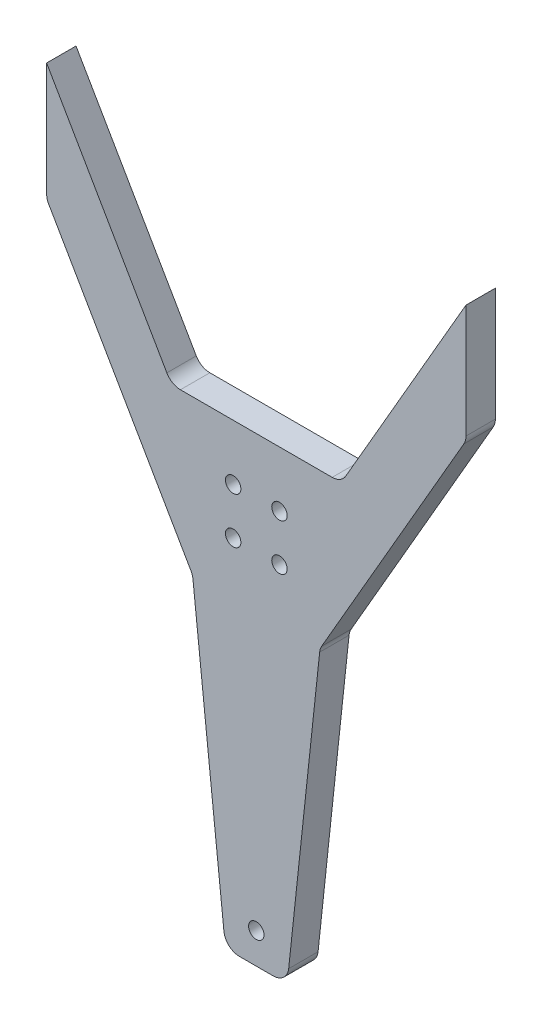
ISO-10303-21;
HEADER;
FILE_DESCRIPTION(('STEP AP214'),'2;1');
FILE_NAME('part.step','',(''),(''),'','','');
FILE_SCHEMA(('AUTOMOTIVE_DESIGN { 1 0 10303 214 1 1 1 1 }'));
ENDSEC;
DATA;
#1=APPLICATION_CONTEXT('core data for automotive mechanical design processes');
#2=APPLICATION_PROTOCOL_DEFINITION('international standard','automotive_design',2000,#1);
#3=PRODUCT_CONTEXT('',#1,'mechanical');
#4=PRODUCT('Part','Part','',(#3));
#5=PRODUCT_RELATED_PRODUCT_CATEGORY('part','',(#4));
#6=PRODUCT_DEFINITION_FORMATION('','',#4);
#7=PRODUCT_DEFINITION_CONTEXT('part definition',#1,'design');
#8=PRODUCT_DEFINITION('design','',#6,#7);
#9=PRODUCT_DEFINITION_SHAPE('','',#8);
#10=(LENGTH_UNIT() NAMED_UNIT(*) SI_UNIT(.MILLI.,.METRE.));
#11=(NAMED_UNIT(*) PLANE_ANGLE_UNIT() SI_UNIT($,.RADIAN.));
#12=(NAMED_UNIT(*) SI_UNIT($,.STERADIAN.) SOLID_ANGLE_UNIT());
#13=UNCERTAINTY_MEASURE_WITH_UNIT(LENGTH_MEASURE(1.E-05),#10,'distance_accuracy_value','');
#14=(GEOMETRIC_REPRESENTATION_CONTEXT(3) GLOBAL_UNCERTAINTY_ASSIGNED_CONTEXT((#13)) GLOBAL_UNIT_ASSIGNED_CONTEXT((#10,
#11,#12)) REPRESENTATION_CONTEXT('',''));
#15=CARTESIAN_POINT('',(0.,0.,0.));
#16=DIRECTION('',(0.,0.,1.));
#17=DIRECTION('',(1.,0.,0.));
#18=AXIS2_PLACEMENT_3D('',#15,#16,#17);
#19=CARTESIAN_POINT('',(-67.9249870466306,120.,9.525));
#20=DIRECTION('',(-0.866025403784436,-0.500000000000004,0.));
#21=DIRECTION('',(0.500000000000004,-0.866025403784436,0.));
#22=AXIS2_PLACEMENT_3D('',#19,#20,#21);
#23=PLANE('',#22);
#24=DIRECTION('',(-0.500000000000004,0.866025403784436,0.));
#25=VECTOR('',#24,1.);
#26=CARTESIAN_POINT('',(-67.9249870466306,120.,9.525));
#27=LINE('',#26,#25);
#28=CARTESIAN_POINT('',(-28.976937887098,52.5400000000001,9.525));
#29=VERTEX_POINT('',#28);
#30=CARTESIAN_POINT('',(-67.9249870466306,120.,9.525));
#31=VERTEX_POINT('',#30);
#32=EDGE_CURVE('E166',#29,#31,#27,.T.);
#33=ORIENTED_EDGE('',*,*,#32,.F.);
#34=DIRECTION('',(0.,0.,-1.));
#35=VECTOR('',#34,1.);
#36=CARTESIAN_POINT('',(-28.976937887098,52.5400000000001,0.));
#37=LINE('',#36,#35);
#38=CARTESIAN_POINT('',(-28.976937887098,52.5400000000001,0.));
#39=VERTEX_POINT('',#38);
#40=EDGE_CURVE('E276',#29,#39,#37,.T.);
#41=ORIENTED_EDGE('',*,*,#40,.T.);
#42=DIRECTION('',(-0.500000000000004,0.866025403784436,0.));
#43=VECTOR('',#42,1.);
#44=CARTESIAN_POINT('',(-67.9249870466306,120.,0.));
#45=LINE('',#44,#43);
#46=CARTESIAN_POINT('',(-67.9249870466306,120.,0.));
#47=VERTEX_POINT('',#46);
#48=EDGE_CURVE('E190',#39,#47,#45,.T.);
#49=ORIENTED_EDGE('',*,*,#48,.T.);
#50=DIRECTION('',(0.,0.,-1.));
#51=VECTOR('',#50,1.);
#52=CARTESIAN_POINT('',(-67.9249870466306,120.,9.525));
#53=LINE('',#52,#51);
#54=EDGE_CURVE('E184',#31,#47,#53,.T.);
#55=ORIENTED_EDGE('',*,*,#54,.F.);
#56=EDGE_LOOP('',(#33,#41,#49,#55));
#57=FACE_BOUND('',#56,.T.);
#58=ADVANCED_FACE('F41',(#57),#23,.F.);
#59=CARTESIAN_POINT('',(-67.9249870466306,120.,9.525));
#60=DIRECTION('',(1.,0.,0.));
#61=DIRECTION('',(0.,0.,-1.));
#62=AXIS2_PLACEMENT_3D('',#59,#60,#61);
#63=PLANE('',#62);
#64=DIRECTION('',(0.,-1.,0.));
#65=VECTOR('',#64,1.);
#66=CARTESIAN_POINT('',(-67.9249870466306,120.,0.));
#67=LINE('',#66,#65);
#68=CARTESIAN_POINT('',(-67.9249870466306,83.2611818975512,0.));
#69=VERTEX_POINT('',#68);
#70=EDGE_CURVE('E310',#47,#69,#67,.T.);
#71=ORIENTED_EDGE('',*,*,#70,.T.);
#72=DIRECTION('',(0.,0.,-1.));
#73=VECTOR('',#72,1.);
#74=CARTESIAN_POINT('',(-67.9249870466306,83.2611818975512,9.525));
#75=LINE('',#74,#73);
#76=CARTESIAN_POINT('',(-67.9249870466306,83.2611818975512,9.525));
#77=VERTEX_POINT('',#76);
#78=EDGE_CURVE('E186',#69,#77,#75,.F.);
#79=ORIENTED_EDGE('',*,*,#78,.T.);
#80=DIRECTION('',(0.,-1.,0.));
#81=VECTOR('',#80,1.);
#82=CARTESIAN_POINT('',(-67.9249870466306,120.,9.525));
#83=LINE('',#82,#81);
#84=EDGE_CURVE('E170',#31,#77,#83,.T.);
#85=ORIENTED_EDGE('',*,*,#84,.F.);
#86=ORIENTED_EDGE('',*,*,#54,.T.);
#87=EDGE_LOOP('',(#71,#79,#85,#86));
#88=FACE_BOUND('',#87,.T.);
#89=ADVANCED_FACE('F183',(#88),#63,.F.);
#90=CARTESIAN_POINT('',(-20.6399999999992,0.,9.525));
#91=DIRECTION('',(0.866025403784436,0.500000000000004,0.));
#92=DIRECTION('',(-0.500000000000004,0.866025403784436,0.));
#93=AXIS2_PLACEMENT_3D('',#90,#91,#92);
#94=PLANE('',#93);
#95=DIRECTION('',(0.500000000000004,-0.866025403784436,0.));
#96=VECTOR('',#95,1.);
#97=CARTESIAN_POINT('',(-20.6399999999992,0.,9.525));
#98=LINE('',#97,#96);
#99=CARTESIAN_POINT('',(-67.2443960978555,80.7211818975511,9.525));
#100=VERTEX_POINT('',#99);
#101=CARTESIAN_POINT('',(-21.1773959945488,0.930797166343926,9.525));
#102=VERTEX_POINT('',#101);
#103=EDGE_CURVE('E187',#100,#102,#98,.T.);
#104=ORIENTED_EDGE('',*,*,#103,.F.);
#105=DIRECTION('',(0.,0.,-1.));
#106=VECTOR('',#105,1.);
#107=CARTESIAN_POINT('',(-67.2443960978555,80.7211818975511,9.525));
#108=LINE('',#107,#106);
#109=CARTESIAN_POINT('',(-67.2443960978555,80.7211818975511,0.));
#110=VERTEX_POINT('',#109);
#111=EDGE_CURVE('E257',#100,#110,#108,.T.);
#112=ORIENTED_EDGE('',*,*,#111,.T.);
#113=DIRECTION('',(0.500000000000004,-0.866025403784436,0.));
#114=VECTOR('',#113,1.);
#115=CARTESIAN_POINT('',(-20.6399999999992,0.,0.));
#116=LINE('',#115,#114);
#117=CARTESIAN_POINT('',(-21.1773959945488,0.930797166343926,0.));
#118=VERTEX_POINT('',#117);
#119=EDGE_CURVE('E299',#110,#118,#116,.T.);
#120=ORIENTED_EDGE('',*,*,#119,.T.);
#121=DIRECTION('',(0.,0.,-1.));
#122=VECTOR('',#121,1.);
#123=CARTESIAN_POINT('',(-21.1773959945488,0.930797166343927,9.525));
#124=LINE('',#123,#122);
#125=EDGE_CURVE('E253',#118,#102,#124,.F.);
#126=ORIENTED_EDGE('',*,*,#125,.T.);
#127=EDGE_LOOP('',(#104,#112,#120,#126));
#128=FACE_BOUND('',#127,.T.);
#129=ADVANCED_FACE('F307',(#128),#94,.F.);
#130=CARTESIAN_POINT('',(-10.,-99.4323408152499,9.525));
#131=DIRECTION('',(0.994323408152499,0.106399999999992,0.));
#132=DIRECTION('',(-0.106399999999992,0.994323408152499,0.));
#133=AXIS2_PLACEMENT_3D('',#130,#131,#132);
#134=PLANE('',#133);
#135=DIRECTION('',(0.106399999999992,-0.994323408152499,0.));
#136=VECTOR('',#135,1.);
#137=CARTESIAN_POINT('',(-10.,-99.4323408152499,0.));
#138=LINE('',#137,#136);
#139=CARTESIAN_POINT('',(-20.525642132359,-1.06869083365616,0.));
#140=VERTEX_POINT('',#139);
#141=CARTESIAN_POINT('',(-10.4857589786581,-94.8928528152499,0.));
#142=VERTEX_POINT('',#141);
#143=EDGE_CURVE('E301',#140,#142,#138,.T.);
#144=ORIENTED_EDGE('',*,*,#143,.T.);
#145=DIRECTION('',(0.,0.,-1.));
#146=VECTOR('',#145,1.);
#147=CARTESIAN_POINT('',(-10.4857589786581,-94.8928528152499,9.525));
#148=LINE('',#147,#146);
#149=CARTESIAN_POINT('',(-10.4857589786581,-94.8928528152499,9.525));
#150=VERTEX_POINT('',#149);
#151=EDGE_CURVE('E269',#142,#150,#148,.F.);
#152=ORIENTED_EDGE('',*,*,#151,.T.);
#153=DIRECTION('',(0.106399999999992,-0.994323408152499,0.));
#154=VECTOR('',#153,1.);
#155=CARTESIAN_POINT('',(-10.,-99.4323408152499,9.525));
#156=LINE('',#155,#154);
#157=CARTESIAN_POINT('',(-20.525642132359,-1.06869083365616,9.525));
#158=VERTEX_POINT('',#157);
#159=EDGE_CURVE('E230',#158,#150,#156,.T.);
#160=ORIENTED_EDGE('',*,*,#159,.F.);
#161=DIRECTION('',(0.,0.,-1.));
#162=VECTOR('',#161,1.);
#163=CARTESIAN_POINT('',(-20.525642132359,-1.06869083365613,0.));
#164=LINE('',#163,#162);
#165=EDGE_CURVE('E266',#158,#140,#164,.T.);
#166=ORIENTED_EDGE('',*,*,#165,.T.);
#167=EDGE_LOOP('',(#144,#152,#160,#166));
#168=FACE_BOUND('',#167,.T.);
#169=ADVANCED_FACE('F317',(#168),#134,.F.);
#170=CARTESIAN_POINT('',(10.,-99.4323408152499,9.525));
#171=DIRECTION('',(0.,1.,0.));
#172=DIRECTION('',(0.,0.,1.));
#173=AXIS2_PLACEMENT_3D('',#170,#171,#172);
#174=PLANE('',#173);
#175=DIRECTION('',(1.,0.,0.));
#176=VECTOR('',#175,1.);
#177=CARTESIAN_POINT('',(10.,-99.4323408152499,9.525));
#178=LINE('',#177,#176);
#179=CARTESIAN_POINT('',(-5.43459606524337,-99.4323408152499,9.525));
#180=VERTEX_POINT('',#179);
#181=CARTESIAN_POINT('',(5.43459606524337,-99.4323408152499,9.525));
#182=VERTEX_POINT('',#181);
#183=EDGE_CURVE('E225',#180,#182,#178,.T.);
#184=ORIENTED_EDGE('',*,*,#183,.F.);
#185=DIRECTION('',(0.,0.,-1.));
#186=VECTOR('',#185,1.);
#187=CARTESIAN_POINT('',(-5.43459606524337,-99.4323408152499,9.525));
#188=LINE('',#187,#186);
#189=CARTESIAN_POINT('',(-5.43459606524337,-99.4323408152499,0.));
#190=VERTEX_POINT('',#189);
#191=EDGE_CURVE('E263',#180,#190,#188,.T.);
#192=ORIENTED_EDGE('',*,*,#191,.T.);
#193=DIRECTION('',(1.,0.,0.));
#194=VECTOR('',#193,1.);
#195=CARTESIAN_POINT('',(10.,-99.4323408152499,0.));
#196=LINE('',#195,#194);
#197=CARTESIAN_POINT('',(5.43459606524337,-99.4323408152499,0.));
#198=VERTEX_POINT('',#197);
#199=EDGE_CURVE('E461',#190,#198,#196,.T.);
#200=ORIENTED_EDGE('',*,*,#199,.T.);
#201=DIRECTION('',(0.,0.,-1.));
#202=VECTOR('',#201,1.);
#203=CARTESIAN_POINT('',(5.43459606524337,-99.4323408152499,9.525));
#204=LINE('',#203,#202);
#205=EDGE_CURVE('E261',#198,#182,#204,.F.);
#206=ORIENTED_EDGE('',*,*,#205,.T.);
#207=EDGE_LOOP('',(#184,#192,#200,#206));
#208=FACE_BOUND('',#207,.T.);
#209=ADVANCED_FACE('F478',(#208),#174,.F.);
#210=CARTESIAN_POINT('',(20.6399999999992,0.,9.525));
#211=DIRECTION('',(-0.994323408152499,0.106399999999992,0.));
#212=DIRECTION('',(-0.106399999999992,-0.994323408152499,0.));
#213=AXIS2_PLACEMENT_3D('',#210,#211,#212);
#214=PLANE('',#213);
#215=DIRECTION('',(0.106399999999992,0.994323408152499,0.));
#216=VECTOR('',#215,1.);
#217=CARTESIAN_POINT('',(20.6399999999992,0.,9.525));
#218=LINE('',#217,#216);
#219=CARTESIAN_POINT('',(10.4857589786581,-94.8928528152499,9.525));
#220=VERTEX_POINT('',#219);
#221=CARTESIAN_POINT('',(20.5256421323591,-1.0686908336561,9.525));
#222=VERTEX_POINT('',#221);
#223=EDGE_CURVE('E229',#220,#222,#218,.T.);
#224=ORIENTED_EDGE('',*,*,#223,.F.);
#225=DIRECTION('',(0.,0.,-1.));
#226=VECTOR('',#225,1.);
#227=CARTESIAN_POINT('',(10.4857589786581,-94.8928528152499,9.525));
#228=LINE('',#227,#226);
#229=CARTESIAN_POINT('',(10.4857589786581,-94.8928528152499,0.));
#230=VERTEX_POINT('',#229);
#231=EDGE_CURVE('E273',#220,#230,#228,.T.);
#232=ORIENTED_EDGE('',*,*,#231,.T.);
#233=DIRECTION('',(0.106399999999992,0.994323408152499,0.));
#234=VECTOR('',#233,1.);
#235=CARTESIAN_POINT('',(20.6399999999992,0.,0.));
#236=LINE('',#235,#234);
#237=CARTESIAN_POINT('',(20.5256421323591,-1.0686908336561,0.));
#238=VERTEX_POINT('',#237);
#239=EDGE_CURVE('E464',#230,#238,#236,.T.);
#240=ORIENTED_EDGE('',*,*,#239,.T.);
#241=DIRECTION('',(0.,0.,-1.));
#242=VECTOR('',#241,1.);
#243=CARTESIAN_POINT('',(20.5256421323591,-1.0686908336561,9.525));
#244=LINE('',#243,#242);
#245=EDGE_CURVE('E271',#238,#222,#244,.F.);
#246=ORIENTED_EDGE('',*,*,#245,.T.);
#247=EDGE_LOOP('',(#224,#232,#240,#246));
#248=FACE_BOUND('',#247,.T.);
#249=ADVANCED_FACE('F484',(#248),#214,.F.);
#250=CARTESIAN_POINT('',(67.9249870466299,81.9000000000009,9.525));
#251=DIRECTION('',(-0.86602540378444,0.499999999999998,0.));
#252=DIRECTION('',(-0.499999999999998,-0.86602540378444,0.));
#253=AXIS2_PLACEMENT_3D('',#250,#251,#252);
#254=PLANE('',#253);
#255=DIRECTION('',(0.499999999999998,0.86602540378444,0.));
#256=VECTOR('',#255,1.);
#257=CARTESIAN_POINT('',(67.9249870466299,81.9000000000009,0.));
#258=LINE('',#257,#256);
#259=CARTESIAN_POINT('',(21.1773959945488,0.930797166343936,0.));
#260=VERTEX_POINT('',#259);
#261=CARTESIAN_POINT('',(67.2443960978548,80.7211818975509,0.));
#262=VERTEX_POINT('',#261);
#263=EDGE_CURVE('E447',#260,#262,#258,.T.);
#264=ORIENTED_EDGE('',*,*,#263,.T.);
#265=DIRECTION('',(0.,0.,-1.));
#266=VECTOR('',#265,1.);
#267=CARTESIAN_POINT('',(67.2443960978548,80.7211818975509,9.525));
#268=LINE('',#267,#266);
#269=CARTESIAN_POINT('',(67.2443960978548,80.7211818975509,9.525));
#270=VERTEX_POINT('',#269);
#271=EDGE_CURVE('E213',#262,#270,#268,.F.);
#272=ORIENTED_EDGE('',*,*,#271,.T.);
#273=DIRECTION('',(0.499999999999998,0.86602540378444,0.));
#274=VECTOR('',#273,1.);
#275=CARTESIAN_POINT('',(67.9249870466299,81.9000000000009,9.525));
#276=LINE('',#275,#274);
#277=CARTESIAN_POINT('',(21.1773959945488,0.930797166343936,9.525));
#278=VERTEX_POINT('',#277);
#279=EDGE_CURVE('E236',#278,#270,#276,.T.);
#280=ORIENTED_EDGE('',*,*,#279,.F.);
#281=DIRECTION('',(0.,0.,-1.));
#282=VECTOR('',#281,1.);
#283=CARTESIAN_POINT('',(21.1773959945488,0.930797166343923,0.));
#284=LINE('',#283,#282);
#285=EDGE_CURVE('E210',#278,#260,#284,.T.);
#286=ORIENTED_EDGE('',*,*,#285,.T.);
#287=EDGE_LOOP('',(#264,#272,#280,#286));
#288=FACE_BOUND('',#287,.T.);
#289=ADVANCED_FACE('F444',(#288),#254,.F.);
#290=CARTESIAN_POINT('',(67.9249870466299,120.,9.525));
#291=DIRECTION('',(-1.,0.,0.));
#292=DIRECTION('',(0.,-1.,0.));
#293=AXIS2_PLACEMENT_3D('',#290,#291,#292);
#294=PLANE('',#293);
#295=DIRECTION('',(0.,1.,0.));
#296=VECTOR('',#295,1.);
#297=CARTESIAN_POINT('',(67.9249870466299,120.,9.525));
#298=LINE('',#297,#296);
#299=CARTESIAN_POINT('',(67.9249870466299,83.2611818975509,9.525));
#300=VERTEX_POINT('',#299);
#301=CARTESIAN_POINT('',(67.9249870466299,120.,9.525));
#302=VERTEX_POINT('',#301);
#303=EDGE_CURVE('E239',#300,#302,#298,.T.);
#304=ORIENTED_EDGE('',*,*,#303,.F.);
#305=DIRECTION('',(0.,0.,-1.));
#306=VECTOR('',#305,1.);
#307=CARTESIAN_POINT('',(67.9249870466299,83.2611818975509,9.525));
#308=LINE('',#307,#306);
#309=CARTESIAN_POINT('',(67.9249870466299,83.2611818975509,0.));
#310=VERTEX_POINT('',#309);
#311=EDGE_CURVE('E192',#300,#310,#308,.T.);
#312=ORIENTED_EDGE('',*,*,#311,.T.);
#313=DIRECTION('',(0.,1.,0.));
#314=VECTOR('',#313,1.);
#315=CARTESIAN_POINT('',(67.9249870466299,120.,0.));
#316=LINE('',#315,#314);
#317=CARTESIAN_POINT('',(67.9249870466299,120.,0.));
#318=VERTEX_POINT('',#317);
#319=EDGE_CURVE('E468',#310,#318,#316,.T.);
#320=ORIENTED_EDGE('',*,*,#319,.T.);
#321=DIRECTION('',(0.,0.,-1.));
#322=VECTOR('',#321,1.);
#323=CARTESIAN_POINT('',(67.9249870466299,120.,9.525));
#324=LINE('',#323,#322);
#325=EDGE_CURVE('E193',#302,#318,#324,.T.);
#326=ORIENTED_EDGE('',*,*,#325,.F.);
#327=EDGE_LOOP('',(#304,#312,#320,#326));
#328=FACE_BOUND('',#327,.T.);
#329=ADVANCED_FACE('F452',(#328),#294,.F.);
#330=CARTESIAN_POINT('',(27.5104682033562,50.,9.525));
#331=DIRECTION('',(0.866025403784439,-0.499999999999999,0.));
#332=DIRECTION('',(0.499999999999999,0.866025403784439,0.));
#333=AXIS2_PLACEMENT_3D('',#330,#331,#332);
#334=PLANE('',#333);
#335=DIRECTION('',(-0.499999999999999,-0.866025403784439,0.));
#336=VECTOR('',#335,1.);
#337=CARTESIAN_POINT('',(27.5104682033562,50.,0.));
#338=LINE('',#337,#336);
#339=CARTESIAN_POINT('',(28.9769378870979,52.54,0.));
#340=VERTEX_POINT('',#339);
#341=EDGE_CURVE('E470',#318,#340,#338,.T.);
#342=ORIENTED_EDGE('',*,*,#341,.T.);
#343=DIRECTION('',(0.,0.,-1.));
#344=VECTOR('',#343,1.);
#345=CARTESIAN_POINT('',(28.9769378870979,52.54,9.525));
#346=LINE('',#345,#344);
#347=CARTESIAN_POINT('',(28.9769378870979,52.54,9.525));
#348=VERTEX_POINT('',#347);
#349=EDGE_CURVE('E282',#340,#348,#346,.F.);
#350=ORIENTED_EDGE('',*,*,#349,.T.);
#351=DIRECTION('',(-0.499999999999999,-0.866025403784439,0.));
#352=VECTOR('',#351,1.);
#353=CARTESIAN_POINT('',(27.5104682033562,50.,9.525));
#354=LINE('',#353,#352);
#355=EDGE_CURVE('E454',#302,#348,#354,.T.);
#356=ORIENTED_EDGE('',*,*,#355,.F.);
#357=ORIENTED_EDGE('',*,*,#325,.T.);
#358=EDGE_LOOP('',(#342,#350,#356,#357));
#359=FACE_BOUND('',#358,.T.);
#360=ADVANCED_FACE('F487',(#359),#334,.F.);
#361=CARTESIAN_POINT('',(-27.5104682033563,50.0000000000001,9.525));
#362=DIRECTION('',(0.,-1.,0.));
#363=DIRECTION('',(1.,0.,0.));
#364=AXIS2_PLACEMENT_3D('',#361,#362,#363);
#365=PLANE('',#364);
#366=DIRECTION('',(-1.,0.,0.));
#367=VECTOR('',#366,1.);
#368=CARTESIAN_POINT('',(-27.5104682033563,50.0000000000001,0.));
#369=LINE('',#368,#367);
#370=CARTESIAN_POINT('',(24.5775288358729,50.,0.));
#371=VERTEX_POINT('',#370);
#372=CARTESIAN_POINT('',(-24.577528835873,50.0000000000001,0.));
#373=VERTEX_POINT('',#372);
#374=EDGE_CURVE('E178',#371,#373,#369,.T.);
#375=ORIENTED_EDGE('',*,*,#374,.T.);
#376=DIRECTION('',(0.,0.,-1.));
#377=VECTOR('',#376,1.);
#378=CARTESIAN_POINT('',(-24.577528835873,50.0000000000001,9.525));
#379=LINE('',#378,#377);
#380=CARTESIAN_POINT('',(-24.577528835873,50.0000000000001,9.525));
#381=VERTEX_POINT('',#380);
#382=EDGE_CURVE('E56',#373,#381,#379,.F.);
#383=ORIENTED_EDGE('',*,*,#382,.T.);
#384=DIRECTION('',(-1.,0.,0.));
#385=VECTOR('',#384,1.);
#386=CARTESIAN_POINT('',(-27.5104682033563,50.0000000000001,9.525));
#387=LINE('',#386,#385);
#388=CARTESIAN_POINT('',(24.5775288358729,50.,9.525));
#389=VERTEX_POINT('',#388);
#390=EDGE_CURVE('E199',#389,#381,#387,.T.);
#391=ORIENTED_EDGE('',*,*,#390,.F.);
#392=DIRECTION('',(0.,0.,-1.));
#393=VECTOR('',#392,1.);
#394=CARTESIAN_POINT('',(24.5775288358729,50.,0.));
#395=LINE('',#394,#393);
#396=EDGE_CURVE('E278',#389,#371,#395,.T.);
#397=ORIENTED_EDGE('',*,*,#396,.T.);
#398=EDGE_LOOP('',(#375,#383,#391,#397));
#399=FACE_BOUND('',#398,.T.);
#400=ADVANCED_FACE('F377',(#399),#365,.F.);
#401=CARTESIAN_POINT('',(0.,0.,9.525));
#402=DIRECTION('',(0.,0.,1.));
#403=DIRECTION('',(1.,0.,0.));
#404=AXIS2_PLACEMENT_3D('',#401,#402,#403);
#405=PLANE('',#404);
#406=CARTESIAN_POINT('',(0.,-89.4323408152499,9.525));
#407=DIRECTION('',(0.,0.,1.));
#408=DIRECTION('',(1.,0.,0.));
#409=AXIS2_PLACEMENT_3D('',#406,#407,#408);
#410=CIRCLE('',#409,2.5);
#411=CARTESIAN_POINT('',(2.5,-89.4323408152499,9.525));
#412=VERTEX_POINT('',#411);
#413=EDGE_CURVE('E359',#412,#412,#410,.T.);
#414=ORIENTED_EDGE('',*,*,#413,.F.);
#415=EDGE_LOOP('',(#414));
#416=FACE_BOUND('',#415,.T.);
#417=CARTESIAN_POINT('',(7.5,31.965654583172,9.525));
#418=DIRECTION('',(0.,0.,-1.));
#419=DIRECTION('',(-1.,0.,0.));
#420=AXIS2_PLACEMENT_3D('',#417,#418,#419);
#421=CIRCLE('',#420,2.5);
#422=CARTESIAN_POINT('',(5.,31.965654583172,9.525));
#423=VERTEX_POINT('',#422);
#424=EDGE_CURVE('E351',#423,#423,#421,.T.);
#425=ORIENTED_EDGE('',*,*,#424,.T.);
#426=EDGE_LOOP('',(#425));
#427=FACE_BOUND('',#426,.T.);
#428=CARTESIAN_POINT('',(-7.5,31.965654583172,9.525));
#429=DIRECTION('',(0.,0.,-1.));
#430=DIRECTION('',(-1.,0.,0.));
#431=AXIS2_PLACEMENT_3D('',#428,#429,#430);
#432=CIRCLE('',#431,2.5);
#433=CARTESIAN_POINT('',(-10.,31.965654583172,9.525));
#434=VERTEX_POINT('',#433);
#435=EDGE_CURVE('E345',#434,#434,#432,.T.);
#436=ORIENTED_EDGE('',*,*,#435,.T.);
#437=EDGE_LOOP('',(#436));
#438=FACE_BOUND('',#437,.T.);
#439=CARTESIAN_POINT('',(7.5,16.965654583172,9.525));
#440=DIRECTION('',(0.,0.,-1.));
#441=DIRECTION('',(-1.,0.,0.));
#442=AXIS2_PLACEMENT_3D('',#439,#440,#441);
#443=CIRCLE('',#442,2.5);
#444=CARTESIAN_POINT('',(5.,16.965654583172,9.525));
#445=VERTEX_POINT('',#444);
#446=EDGE_CURVE('E335',#445,#445,#443,.T.);
#447=ORIENTED_EDGE('',*,*,#446,.T.);
#448=EDGE_LOOP('',(#447));
#449=FACE_BOUND('',#448,.T.);
#450=CARTESIAN_POINT('',(-7.5,16.965654583172,9.525));
#451=DIRECTION('',(0.,0.,-1.));
#452=DIRECTION('',(-1.,0.,0.));
#453=AXIS2_PLACEMENT_3D('',#450,#451,#452);
#454=CIRCLE('',#453,2.5);
#455=CARTESIAN_POINT('',(-10.,16.965654583172,9.525));
#456=VERTEX_POINT('',#455);
#457=EDGE_CURVE('E328',#456,#456,#454,.T.);
#458=ORIENTED_EDGE('',*,*,#457,.T.);
#459=EDGE_LOOP('',(#458));
#460=FACE_BOUND('',#459,.T.);
#461=ORIENTED_EDGE('',*,*,#279,.T.);
#462=CARTESIAN_POINT('',(62.8449870466298,83.2611818975509,9.525));
#463=DIRECTION('',(0.,0.,1.));
#464=DIRECTION('',(1.,0.,0.));
#465=AXIS2_PLACEMENT_3D('',#462,#463,#464);
#466=CIRCLE('',#465,5.08);
#467=EDGE_CURVE('E250',#270,#300,#466,.T.);
#468=ORIENTED_EDGE('',*,*,#467,.T.);
#469=ORIENTED_EDGE('',*,*,#303,.T.);
#470=ORIENTED_EDGE('',*,*,#355,.T.);
#471=CARTESIAN_POINT('',(24.5775288358729,55.08,9.525));
#472=DIRECTION('',(0.,0.,1.));
#473=DIRECTION('',(1.,0.,0.));
#474=AXIS2_PLACEMENT_3D('',#471,#472,#473);
#475=CIRCLE('',#474,5.08);
#476=EDGE_CURVE('E63',#348,#389,#475,.F.);
#477=ORIENTED_EDGE('',*,*,#476,.T.);
#478=ORIENTED_EDGE('',*,*,#390,.T.);
#479=CARTESIAN_POINT('',(-24.577528835873,55.0800000000001,9.525));
#480=DIRECTION('',(0.,0.,1.));
#481=DIRECTION('',(1.,0.,0.));
#482=AXIS2_PLACEMENT_3D('',#479,#480,#481);
#483=CIRCLE('',#482,5.08);
#484=EDGE_CURVE('E173',#381,#29,#483,.F.);
#485=ORIENTED_EDGE('',*,*,#484,.T.);
#486=ORIENTED_EDGE('',*,*,#32,.T.);
#487=ORIENTED_EDGE('',*,*,#84,.T.);
#488=CARTESIAN_POINT('',(-62.8449870466306,83.2611818975512,9.525));
#489=DIRECTION('',(0.,0.,1.));
#490=DIRECTION('',(1.,0.,0.));
#491=AXIS2_PLACEMENT_3D('',#488,#489,#490);
#492=CIRCLE('',#491,5.08);
#493=EDGE_CURVE('E254',#77,#100,#492,.T.);
#494=ORIENTED_EDGE('',*,*,#493,.T.);
#495=ORIENTED_EDGE('',*,*,#103,.T.);
#496=CARTESIAN_POINT('',(-25.5768050457737,-1.60920283365609,9.525));
#497=DIRECTION('',(0.,0.,1.));
#498=DIRECTION('',(1.,0.,0.));
#499=AXIS2_PLACEMENT_3D('',#496,#497,#498);
#500=CIRCLE('',#499,5.08);
#501=EDGE_CURVE('E12',#102,#158,#500,.F.);
#502=ORIENTED_EDGE('',*,*,#501,.T.);
#503=ORIENTED_EDGE('',*,*,#159,.T.);
#504=CARTESIAN_POINT('',(-5.43459606524337,-94.3523408152499,9.525));
#505=DIRECTION('',(0.,0.,1.));
#506=DIRECTION('',(1.,0.,0.));
#507=AXIS2_PLACEMENT_3D('',#504,#505,#506);
#508=CIRCLE('',#507,5.08);
#509=EDGE_CURVE('E218',#150,#180,#508,.T.);
#510=ORIENTED_EDGE('',*,*,#509,.T.);
#511=ORIENTED_EDGE('',*,*,#183,.T.);
#512=CARTESIAN_POINT('',(5.43459606524337,-94.3523408152499,9.525));
#513=DIRECTION('',(0.,0.,1.));
#514=DIRECTION('',(1.,0.,0.));
#515=AXIS2_PLACEMENT_3D('',#512,#513,#514);
#516=CIRCLE('',#515,5.08);
#517=EDGE_CURVE('E215',#182,#220,#516,.T.);
#518=ORIENTED_EDGE('',*,*,#517,.T.);
#519=ORIENTED_EDGE('',*,*,#223,.T.);
#520=CARTESIAN_POINT('',(25.5768050457738,-1.60920283365606,9.525));
#521=DIRECTION('',(0.,0.,1.));
#522=DIRECTION('',(1.,0.,0.));
#523=AXIS2_PLACEMENT_3D('',#520,#521,#522);
#524=CIRCLE('',#523,5.08);
#525=EDGE_CURVE('E292',#222,#278,#524,.F.);
#526=ORIENTED_EDGE('',*,*,#525,.T.);
#527=EDGE_LOOP('',(#461,#468,#469,#470,#477,#478,#485,#486,#487,#494,#495,#502,#503,#510,#511,
#518,#519,#526));
#528=FACE_BOUND('',#527,.T.);
#529=ADVANCED_FACE('F169',(#416,#427,#438,#449,#460,#528),#405,.T.);
#530=CARTESIAN_POINT('',(0.,0.,0.));
#531=DIRECTION('',(0.,0.,1.));
#532=DIRECTION('',(1.,0.,0.));
#533=AXIS2_PLACEMENT_3D('',#530,#531,#532);
#534=PLANE('',#533);
#535=CARTESIAN_POINT('',(0.,-89.4323408152499,0.));
#536=DIRECTION('',(0.,0.,1.));
#537=DIRECTION('',(1.,0.,0.));
#538=AXIS2_PLACEMENT_3D('',#535,#536,#537);
#539=CIRCLE('',#538,2.5);
#540=CARTESIAN_POINT('',(2.5,-89.4323408152499,0.));
#541=VERTEX_POINT('',#540);
#542=EDGE_CURVE('E358',#541,#541,#539,.T.);
#543=ORIENTED_EDGE('',*,*,#542,.T.);
#544=EDGE_LOOP('',(#543));
#545=FACE_BOUND('',#544,.T.);
#546=CARTESIAN_POINT('',(7.5,31.965654583172,0.));
#547=DIRECTION('',(0.,0.,-1.));
#548=DIRECTION('',(-1.,0.,0.));
#549=AXIS2_PLACEMENT_3D('',#546,#547,#548);
#550=CIRCLE('',#549,2.5);
#551=CARTESIAN_POINT('',(5.,31.965654583172,0.));
#552=VERTEX_POINT('',#551);
#553=EDGE_CURVE('E355',#552,#552,#550,.T.);
#554=ORIENTED_EDGE('',*,*,#553,.F.);
#555=EDGE_LOOP('',(#554));
#556=FACE_BOUND('',#555,.T.);
#557=CARTESIAN_POINT('',(-7.5,31.965654583172,0.));
#558=DIRECTION('',(0.,0.,-1.));
#559=DIRECTION('',(-1.,0.,0.));
#560=AXIS2_PLACEMENT_3D('',#557,#558,#559);
#561=CIRCLE('',#560,2.5);
#562=CARTESIAN_POINT('',(-10.,31.965654583172,0.));
#563=VERTEX_POINT('',#562);
#564=EDGE_CURVE('E349',#563,#563,#561,.T.);
#565=ORIENTED_EDGE('',*,*,#564,.F.);
#566=EDGE_LOOP('',(#565));
#567=FACE_BOUND('',#566,.T.);
#568=CARTESIAN_POINT('',(7.5,16.965654583172,0.));
#569=DIRECTION('',(0.,0.,-1.));
#570=DIRECTION('',(-1.,0.,0.));
#571=AXIS2_PLACEMENT_3D('',#568,#569,#570);
#572=CIRCLE('',#571,2.5);
#573=CARTESIAN_POINT('',(5.,16.965654583172,0.));
#574=VERTEX_POINT('',#573);
#575=EDGE_CURVE('E339',#574,#574,#572,.T.);
#576=ORIENTED_EDGE('',*,*,#575,.F.);
#577=EDGE_LOOP('',(#576));
#578=FACE_BOUND('',#577,.T.);
#579=CARTESIAN_POINT('',(-7.5,16.965654583172,0.));
#580=DIRECTION('',(0.,0.,-1.));
#581=DIRECTION('',(-1.,0.,0.));
#582=AXIS2_PLACEMENT_3D('',#579,#580,#581);
#583=CIRCLE('',#582,2.5);
#584=CARTESIAN_POINT('',(-10.,16.965654583172,0.));
#585=VERTEX_POINT('',#584);
#586=EDGE_CURVE('E332',#585,#585,#583,.T.);
#587=ORIENTED_EDGE('',*,*,#586,.F.);
#588=EDGE_LOOP('',(#587));
#589=FACE_BOUND('',#588,.T.);
#590=ORIENTED_EDGE('',*,*,#319,.F.);
#591=CARTESIAN_POINT('',(62.8449870466298,83.2611818975509,0.));
#592=DIRECTION('',(0.,0.,1.));
#593=DIRECTION('',(1.,0.,0.));
#594=AXIS2_PLACEMENT_3D('',#591,#592,#593);
#595=CIRCLE('',#594,5.08);
#596=EDGE_CURVE('E208',#310,#262,#595,.F.);
#597=ORIENTED_EDGE('',*,*,#596,.T.);
#598=ORIENTED_EDGE('',*,*,#263,.F.);
#599=CARTESIAN_POINT('',(25.5768050457738,-1.60920283365606,0.));
#600=DIRECTION('',(0.,0.,1.));
#601=DIRECTION('',(1.,0.,0.));
#602=AXIS2_PLACEMENT_3D('',#599,#600,#601);
#603=CIRCLE('',#602,5.08);
#604=EDGE_CURVE('E290',#260,#238,#603,.T.);
#605=ORIENTED_EDGE('',*,*,#604,.T.);
#606=ORIENTED_EDGE('',*,*,#239,.F.);
#607=CARTESIAN_POINT('',(5.43459606524337,-94.3523408152499,0.));
#608=DIRECTION('',(0.,0.,1.));
#609=DIRECTION('',(1.,0.,0.));
#610=AXIS2_PLACEMENT_3D('',#607,#608,#609);
#611=CIRCLE('',#610,5.08);
#612=EDGE_CURVE('E196',#230,#198,#611,.F.);
#613=ORIENTED_EDGE('',*,*,#612,.T.);
#614=ORIENTED_EDGE('',*,*,#199,.F.);
#615=CARTESIAN_POINT('',(-5.43459606524337,-94.3523408152499,0.));
#616=DIRECTION('',(0.,0.,1.));
#617=DIRECTION('',(1.,0.,0.));
#618=AXIS2_PLACEMENT_3D('',#615,#616,#617);
#619=CIRCLE('',#618,5.08);
#620=EDGE_CURVE('E204',#190,#142,#619,.F.);
#621=ORIENTED_EDGE('',*,*,#620,.T.);
#622=ORIENTED_EDGE('',*,*,#143,.F.);
#623=CARTESIAN_POINT('',(-25.5768050457737,-1.60920283365609,0.));
#624=DIRECTION('',(0.,0.,1.));
#625=DIRECTION('',(1.,0.,0.));
#626=AXIS2_PLACEMENT_3D('',#623,#624,#625);
#627=CIRCLE('',#626,5.08);
#628=EDGE_CURVE('E49',#140,#118,#627,.T.);
#629=ORIENTED_EDGE('',*,*,#628,.T.);
#630=ORIENTED_EDGE('',*,*,#119,.F.);
#631=CARTESIAN_POINT('',(-62.8449870466306,83.2611818975512,0.));
#632=DIRECTION('',(0.,0.,1.));
#633=DIRECTION('',(1.,0.,0.));
#634=AXIS2_PLACEMENT_3D('',#631,#632,#633);
#635=CIRCLE('',#634,5.08);
#636=EDGE_CURVE('E206',#110,#69,#635,.F.);
#637=ORIENTED_EDGE('',*,*,#636,.T.);
#638=ORIENTED_EDGE('',*,*,#70,.F.);
#639=ORIENTED_EDGE('',*,*,#48,.F.);
#640=CARTESIAN_POINT('',(-24.577528835873,55.0800000000001,0.));
#641=DIRECTION('',(0.,0.,1.));
#642=DIRECTION('',(1.,0.,0.));
#643=AXIS2_PLACEMENT_3D('',#640,#641,#642);
#644=CIRCLE('',#643,5.08);
#645=EDGE_CURVE('E284',#39,#373,#644,.T.);
#646=ORIENTED_EDGE('',*,*,#645,.T.);
#647=ORIENTED_EDGE('',*,*,#374,.F.);
#648=CARTESIAN_POINT('',(24.5775288358729,55.08,0.));
#649=DIRECTION('',(0.,0.,1.));
#650=DIRECTION('',(1.,0.,0.));
#651=AXIS2_PLACEMENT_3D('',#648,#649,#650);
#652=CIRCLE('',#651,5.08);
#653=EDGE_CURVE('E287',#371,#340,#652,.T.);
#654=ORIENTED_EDGE('',*,*,#653,.T.);
#655=ORIENTED_EDGE('',*,*,#341,.F.);
#656=EDGE_LOOP('',(#590,#597,#598,#605,#606,#613,#614,#621,#622,#629,#630,#637,#638,#639,#646,
#647,#654,#655));
#657=FACE_BOUND('',#656,.T.);
#658=ADVANCED_FACE('F298',(#545,#556,#567,#578,#589,#657),#534,.F.);
#659=CARTESIAN_POINT('',(62.8449870466298,83.2611818975509,9.525));
#660=DIRECTION('',(0.,0.,-1.));
#661=DIRECTION('',(-1.,0.,0.));
#662=AXIS2_PLACEMENT_3D('',#659,#660,#661);
#663=CYLINDRICAL_SURFACE('',#662,5.08);
#664=ORIENTED_EDGE('',*,*,#467,.F.);
#665=ORIENTED_EDGE('',*,*,#271,.F.);
#666=ORIENTED_EDGE('',*,*,#596,.F.);
#667=ORIENTED_EDGE('',*,*,#311,.F.);
#668=EDGE_LOOP('',(#664,#665,#666,#667));
#669=FACE_BOUND('',#668,.T.);
#670=ADVANCED_FACE('F395',(#669),#663,.T.);
#671=CARTESIAN_POINT('',(-62.8449870466306,83.2611818975512,9.525));
#672=DIRECTION('',(0.,0.,-1.));
#673=DIRECTION('',(-1.,0.,0.));
#674=AXIS2_PLACEMENT_3D('',#671,#672,#673);
#675=CYLINDRICAL_SURFACE('',#674,5.08);
#676=ORIENTED_EDGE('',*,*,#493,.F.);
#677=ORIENTED_EDGE('',*,*,#78,.F.);
#678=ORIENTED_EDGE('',*,*,#636,.F.);
#679=ORIENTED_EDGE('',*,*,#111,.F.);
#680=EDGE_LOOP('',(#676,#677,#678,#679));
#681=FACE_BOUND('',#680,.T.);
#682=ADVANCED_FACE('F400',(#681),#675,.T.);
#683=CARTESIAN_POINT('',(-5.43459606524337,-94.3523408152499,9.525));
#684=DIRECTION('',(0.,0.,-1.));
#685=DIRECTION('',(-1.,0.,0.));
#686=AXIS2_PLACEMENT_3D('',#683,#684,#685);
#687=CYLINDRICAL_SURFACE('',#686,5.08);
#688=ORIENTED_EDGE('',*,*,#509,.F.);
#689=ORIENTED_EDGE('',*,*,#151,.F.);
#690=ORIENTED_EDGE('',*,*,#620,.F.);
#691=ORIENTED_EDGE('',*,*,#191,.F.);
#692=EDGE_LOOP('',(#688,#689,#690,#691));
#693=FACE_BOUND('',#692,.T.);
#694=ADVANCED_FACE('F414',(#693),#687,.T.);
#695=CARTESIAN_POINT('',(5.43459606524337,-94.3523408152499,9.525));
#696=DIRECTION('',(0.,0.,-1.));
#697=DIRECTION('',(-1.,0.,0.));
#698=AXIS2_PLACEMENT_3D('',#695,#696,#697);
#699=CYLINDRICAL_SURFACE('',#698,5.08);
#700=ORIENTED_EDGE('',*,*,#517,.F.);
#701=ORIENTED_EDGE('',*,*,#205,.F.);
#702=ORIENTED_EDGE('',*,*,#612,.F.);
#703=ORIENTED_EDGE('',*,*,#231,.F.);
#704=EDGE_LOOP('',(#700,#701,#702,#703));
#705=FACE_BOUND('',#704,.T.);
#706=ADVANCED_FACE('F418',(#705),#699,.T.);
#707=CARTESIAN_POINT('',(-24.577528835873,55.0800000000001,9.525));
#708=DIRECTION('',(0.,0.,1.));
#709=DIRECTION('',(1.,0.,0.));
#710=AXIS2_PLACEMENT_3D('',#707,#708,#709);
#711=CYLINDRICAL_SURFACE('',#710,5.08);
#712=ORIENTED_EDGE('',*,*,#484,.F.);
#713=ORIENTED_EDGE('',*,*,#382,.F.);
#714=ORIENTED_EDGE('',*,*,#645,.F.);
#715=ORIENTED_EDGE('',*,*,#40,.F.);
#716=EDGE_LOOP('',(#712,#713,#714,#715));
#717=FACE_BOUND('',#716,.T.);
#718=ADVANCED_FACE('F422',(#717),#711,.F.);
#719=CARTESIAN_POINT('',(24.5775288358729,55.08,9.525));
#720=DIRECTION('',(0.,0.,1.));
#721=DIRECTION('',(1.,0.,0.));
#722=AXIS2_PLACEMENT_3D('',#719,#720,#721);
#723=CYLINDRICAL_SURFACE('',#722,5.08);
#724=ORIENTED_EDGE('',*,*,#476,.F.);
#725=ORIENTED_EDGE('',*,*,#349,.F.);
#726=ORIENTED_EDGE('',*,*,#653,.F.);
#727=ORIENTED_EDGE('',*,*,#396,.F.);
#728=EDGE_LOOP('',(#724,#725,#726,#727));
#729=FACE_BOUND('',#728,.T.);
#730=ADVANCED_FACE('F426',(#729),#723,.F.);
#731=CARTESIAN_POINT('',(25.5768050457738,-1.60920283365606,9.525));
#732=DIRECTION('',(0.,0.,1.));
#733=DIRECTION('',(1.,0.,0.));
#734=AXIS2_PLACEMENT_3D('',#731,#732,#733);
#735=CYLINDRICAL_SURFACE('',#734,5.08);
#736=ORIENTED_EDGE('',*,*,#525,.F.);
#737=ORIENTED_EDGE('',*,*,#245,.F.);
#738=ORIENTED_EDGE('',*,*,#604,.F.);
#739=ORIENTED_EDGE('',*,*,#285,.F.);
#740=EDGE_LOOP('',(#736,#737,#738,#739));
#741=FACE_BOUND('',#740,.T.);
#742=ADVANCED_FACE('F429',(#741),#735,.F.);
#743=CARTESIAN_POINT('',(-25.5768050457737,-1.60920283365609,9.525));
#744=DIRECTION('',(0.,0.,1.));
#745=DIRECTION('',(1.,0.,0.));
#746=AXIS2_PLACEMENT_3D('',#743,#744,#745);
#747=CYLINDRICAL_SURFACE('',#746,5.08);
#748=ORIENTED_EDGE('',*,*,#501,.F.);
#749=ORIENTED_EDGE('',*,*,#125,.F.);
#750=ORIENTED_EDGE('',*,*,#628,.F.);
#751=ORIENTED_EDGE('',*,*,#165,.F.);
#752=EDGE_LOOP('',(#748,#749,#750,#751));
#753=FACE_BOUND('',#752,.T.);
#754=ADVANCED_FACE('F43',(#753),#747,.F.);
#755=CARTESIAN_POINT('',(-7.5,16.965654583172,0.));
#756=DIRECTION('',(0.,0.,-1.));
#757=DIRECTION('',(-1.,0.,0.));
#758=AXIS2_PLACEMENT_3D('',#755,#756,#757);
#759=CYLINDRICAL_SURFACE('',#758,2.5);
#760=ORIENTED_EDGE('',*,*,#457,.F.);
#761=EDGE_LOOP('',(#760));
#762=FACE_BOUND('',#761,.T.);
#763=ORIENTED_EDGE('',*,*,#586,.T.);
#764=EDGE_LOOP('',(#763));
#765=FACE_BOUND('',#764,.T.);
#766=ADVANCED_FACE('F387',(#762,#765),#759,.F.);
#767=CARTESIAN_POINT('',(7.5,16.965654583172,0.));
#768=DIRECTION('',(0.,0.,-1.));
#769=DIRECTION('',(-1.,0.,0.));
#770=AXIS2_PLACEMENT_3D('',#767,#768,#769);
#771=CYLINDRICAL_SURFACE('',#770,2.5);
#772=ORIENTED_EDGE('',*,*,#446,.F.);
#773=EDGE_LOOP('',(#772));
#774=FACE_BOUND('',#773,.T.);
#775=ORIENTED_EDGE('',*,*,#575,.T.);
#776=EDGE_LOOP('',(#775));
#777=FACE_BOUND('',#776,.T.);
#778=ADVANCED_FACE('F390',(#774,#777),#771,.F.);
#779=CARTESIAN_POINT('',(-7.5,31.965654583172,0.));
#780=DIRECTION('',(0.,0.,-1.));
#781=DIRECTION('',(-1.,0.,0.));
#782=AXIS2_PLACEMENT_3D('',#779,#780,#781);
#783=CYLINDRICAL_SURFACE('',#782,2.5);
#784=ORIENTED_EDGE('',*,*,#435,.F.);
#785=EDGE_LOOP('',(#784));
#786=FACE_BOUND('',#785,.T.);
#787=ORIENTED_EDGE('',*,*,#564,.T.);
#788=EDGE_LOOP('',(#787));
#789=FACE_BOUND('',#788,.T.);
#790=ADVANCED_FACE('F602',(#786,#789),#783,.F.);
#791=CARTESIAN_POINT('',(7.5,31.965654583172,0.));
#792=DIRECTION('',(0.,0.,-1.));
#793=DIRECTION('',(-1.,0.,0.));
#794=AXIS2_PLACEMENT_3D('',#791,#792,#793);
#795=CYLINDRICAL_SURFACE('',#794,2.5);
#796=ORIENTED_EDGE('',*,*,#424,.F.);
#797=EDGE_LOOP('',(#796));
#798=FACE_BOUND('',#797,.T.);
#799=ORIENTED_EDGE('',*,*,#553,.T.);
#800=EDGE_LOOP('',(#799));
#801=FACE_BOUND('',#800,.T.);
#802=ADVANCED_FACE('F371',(#798,#801),#795,.F.);
#803=CARTESIAN_POINT('',(0.,-89.4323408152499,0.));
#804=DIRECTION('',(0.,0.,1.));
#805=DIRECTION('',(1.,0.,0.));
#806=AXIS2_PLACEMENT_3D('',#803,#804,#805);
#807=CYLINDRICAL_SURFACE('',#806,2.5);
#808=CARTESIAN_POINT('',(2.5,-89.4323408152499,0.));
#809=CARTESIAN_POINT('',(2.5,-89.4323408152499,0.0992187499999999));
#810=CARTESIAN_POINT('',(2.5,-89.4323408152499,0.1984375));
#811=CARTESIAN_POINT('',(2.5,-89.4323408152499,0.396875));
#812=CARTESIAN_POINT('',(2.5,-89.4323408152499,0.49609375));
#813=CARTESIAN_POINT('',(2.5,-89.4323408152499,0.69453125));
#814=CARTESIAN_POINT('',(2.5,-89.4323408152499,0.79375));
#815=CARTESIAN_POINT('',(2.5,-89.4323408152499,0.9921875));
#816=CARTESIAN_POINT('',(2.5,-89.4323408152499,1.09140625));
#817=CARTESIAN_POINT('',(2.5,-89.4323408152499,1.28984375));
#818=CARTESIAN_POINT('',(2.5,-89.4323408152499,1.3890625));
#819=CARTESIAN_POINT('',(2.5,-89.4323408152499,1.5875));
#820=CARTESIAN_POINT('',(2.5,-89.4323408152499,1.68671875));
#821=CARTESIAN_POINT('',(2.5,-89.4323408152499,1.88515625));
#822=CARTESIAN_POINT('',(2.5,-89.4323408152499,1.984375));
#823=CARTESIAN_POINT('',(2.5,-89.4323408152499,2.1828125));
#824=CARTESIAN_POINT('',(2.5,-89.4323408152499,2.28203125));
#825=CARTESIAN_POINT('',(2.5,-89.4323408152499,2.48046875));
#826=CARTESIAN_POINT('',(2.5,-89.4323408152499,2.5796875));
#827=CARTESIAN_POINT('',(2.5,-89.4323408152499,2.778125));
#828=CARTESIAN_POINT('',(2.5,-89.4323408152499,2.87734375));
#829=CARTESIAN_POINT('',(2.5,-89.4323408152499,3.07578125));
#830=CARTESIAN_POINT('',(2.5,-89.4323408152499,3.175));
#831=CARTESIAN_POINT('',(2.5,-89.4323408152499,3.3734375));
#832=CARTESIAN_POINT('',(2.5,-89.4323408152499,3.47265625));
#833=CARTESIAN_POINT('',(2.5,-89.4323408152499,3.67109375));
#834=CARTESIAN_POINT('',(2.5,-89.4323408152499,3.7703125));
#835=CARTESIAN_POINT('',(2.5,-89.4323408152499,3.96875));
#836=CARTESIAN_POINT('',(2.5,-89.4323408152499,4.06796875));
#837=CARTESIAN_POINT('',(2.5,-89.4323408152499,4.26640625));
#838=CARTESIAN_POINT('',(2.5,-89.4323408152499,4.365625));
#839=CARTESIAN_POINT('',(2.5,-89.4323408152499,4.5640625));
#840=CARTESIAN_POINT('',(2.5,-89.4323408152499,4.66328125));
#841=CARTESIAN_POINT('',(2.5,-89.4323408152499,4.86171875));
#842=CARTESIAN_POINT('',(2.5,-89.4323408152499,4.9609375));
#843=CARTESIAN_POINT('',(2.5,-89.4323408152499,5.159375));
#844=CARTESIAN_POINT('',(2.5,-89.4323408152499,5.25859375));
#845=CARTESIAN_POINT('',(2.5,-89.4323408152499,5.45703125));
#846=CARTESIAN_POINT('',(2.5,-89.4323408152499,5.55625));
#847=CARTESIAN_POINT('',(2.5,-89.4323408152499,5.7546875));
#848=CARTESIAN_POINT('',(2.5,-89.4323408152499,5.85390625));
#849=CARTESIAN_POINT('',(2.5,-89.4323408152499,6.05234375));
#850=CARTESIAN_POINT('',(2.5,-89.4323408152499,6.1515625));
#851=CARTESIAN_POINT('',(2.5,-89.4323408152499,6.35));
#852=CARTESIAN_POINT('',(2.5,-89.4323408152499,6.44921875));
#853=CARTESIAN_POINT('',(2.5,-89.4323408152499,6.64765625));
#854=CARTESIAN_POINT('',(2.5,-89.4323408152499,6.746875));
#855=CARTESIAN_POINT('',(2.5,-89.4323408152499,6.9453125));
#856=CARTESIAN_POINT('',(2.5,-89.4323408152499,7.04453125));
#857=CARTESIAN_POINT('',(2.5,-89.4323408152499,7.24296875));
#858=CARTESIAN_POINT('',(2.5,-89.4323408152499,7.3421875));
#859=CARTESIAN_POINT('',(2.5,-89.4323408152499,7.540625));
#860=CARTESIAN_POINT('',(2.5,-89.4323408152499,7.63984375));
#861=CARTESIAN_POINT('',(2.5,-89.4323408152499,7.83828125));
#862=CARTESIAN_POINT('',(2.5,-89.4323408152499,7.9375));
#863=CARTESIAN_POINT('',(2.5,-89.4323408152499,8.1359375));
#864=CARTESIAN_POINT('',(2.5,-89.4323408152499,8.23515625));
#865=CARTESIAN_POINT('',(2.5,-89.4323408152499,8.43359375));
#866=CARTESIAN_POINT('',(2.5,-89.4323408152499,8.5328125));
#867=CARTESIAN_POINT('',(2.5,-89.4323408152499,8.73125));
#868=CARTESIAN_POINT('',(2.5,-89.4323408152499,8.83046875));
#869=CARTESIAN_POINT('',(2.5,-89.4323408152499,9.02890625));
#870=CARTESIAN_POINT('',(2.5,-89.4323408152499,9.128125));
#871=CARTESIAN_POINT('',(2.5,-89.4323408152499,9.3265625));
#872=CARTESIAN_POINT('',(2.5,-89.4323408152499,9.42578125));
#873=CARTESIAN_POINT('',(2.5,-89.4323408152499,9.525));
#874=B_SPLINE_CURVE_WITH_KNOTS('',3,(#808,#809,#810,#811,#812,#813,#814,#815,#816,#817,#818,
#819,#820,#821,#822,#823,#824,#825,#826,#827,#828,#829,#830,#831,#832,#833,#834,#835,#836,#837,
#838,#839,#840,#841,#842,#843,#844,#845,#846,#847,#848,#849,#850,#851,#852,#853,#854,#855,#856,
#857,#858,#859,#860,#861,#862,#863,#864,#865,#866,#867,#868,#869,#870,#871,#872,#873),
.UNSPECIFIED.,.F.,.F.,(4,2,2,2,2,2,2,2,2,2,2,2,2,2,2,2,2,2,2,2,2,2,2,2,2,2,2,2,2,2,2,2,4),(0.,
0.29765625,0.5953125,0.89296875,1.190625,1.48828125,1.7859375,2.08359375,2.38125,2.67890625,
2.9765625,3.27421875,3.571875,3.86953125,4.1671875,4.46484375,4.7625,5.06015625,5.3578125,
5.65546875,5.953125,6.25078125,6.5484375,6.84609375,7.14375,7.44140625,7.7390625,8.03671875,
8.334375,8.63203125,8.9296875,9.22734375,9.525),.UNSPECIFIED.);
#875=EDGE_CURVE('BSEAM368',#541,#412,#874,.T.);
#876=ORIENTED_EDGE('',*,*,#542,.F.);
#877=ORIENTED_EDGE('',*,*,#413,.T.);
#878=ORIENTED_EDGE('',*,*,#875,.T.);
#879=ORIENTED_EDGE('',*,*,#875,.F.);
#880=EDGE_LOOP('',(#876,#878,#877,#879));
#881=FACE_BOUND('',#880,.T.);
#882=ADVANCED_FACE('F368',(#881),#807,.F.);
#883=CLOSED_SHELL('',(#58,#89,#129,#169,#209,#249,#289,#329,#360,#400,#529,#658,#670,#682,#694,
#706,#718,#730,#742,#754,#766,#778,#790,#802,#882));
#884=MANIFOLD_SOLID_BREP('B2',#883);
#885=ADVANCED_BREP_SHAPE_REPRESENTATION('',(#18,#884),#14);
#886=SHAPE_DEFINITION_REPRESENTATION(#9,#885);
ENDSEC;
END-ISO-10303-21;
